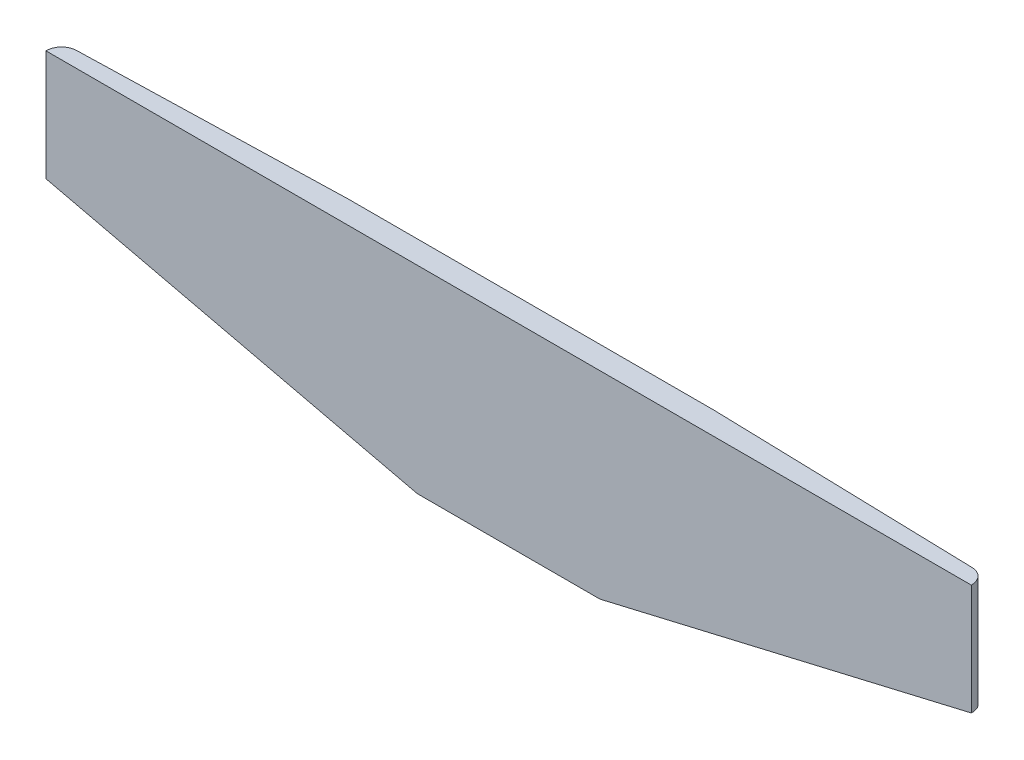
ISO-10303-21;
HEADER;
FILE_DESCRIPTION(('STEP AP214'),'2;1');
FILE_NAME('part.step','',(''),(''),'','','');
FILE_SCHEMA(('AUTOMOTIVE_DESIGN { 1 0 10303 214 1 1 1 1 }'));
ENDSEC;
DATA;
#1=APPLICATION_CONTEXT('core data for automotive mechanical design processes');
#2=APPLICATION_PROTOCOL_DEFINITION('international standard','automotive_design',2000,#1);
#3=PRODUCT_CONTEXT('',#1,'mechanical');
#4=PRODUCT('Part','Part','',(#3));
#5=PRODUCT_RELATED_PRODUCT_CATEGORY('part','',(#4));
#6=PRODUCT_DEFINITION_FORMATION('','',#4);
#7=PRODUCT_DEFINITION_CONTEXT('part definition',#1,'design');
#8=PRODUCT_DEFINITION('design','',#6,#7);
#9=PRODUCT_DEFINITION_SHAPE('','',#8);
#10=(LENGTH_UNIT() NAMED_UNIT(*) SI_UNIT(.MILLI.,.METRE.));
#11=(NAMED_UNIT(*) PLANE_ANGLE_UNIT() SI_UNIT($,.RADIAN.));
#12=(NAMED_UNIT(*) SI_UNIT($,.STERADIAN.) SOLID_ANGLE_UNIT());
#13=UNCERTAINTY_MEASURE_WITH_UNIT(LENGTH_MEASURE(1.E-05),#10,'distance_accuracy_value','');
#14=(GEOMETRIC_REPRESENTATION_CONTEXT(3) GLOBAL_UNCERTAINTY_ASSIGNED_CONTEXT((#13)) GLOBAL_UNIT_ASSIGNED_CONTEXT((#10,
#11,#12)) REPRESENTATION_CONTEXT('',''));
#15=CARTESIAN_POINT('',(0.,0.,0.));
#16=DIRECTION('',(0.,0.,1.));
#17=DIRECTION('',(1.,0.,0.));
#18=AXIS2_PLACEMENT_3D('',#15,#16,#17);
#19=CARTESIAN_POINT('',(6.35,-82.55,-0.170210292050006));
#20=DIRECTION('',(0.,-1.,0.));
#21=DIRECTION('',(0.,0.,-1.));
#22=AXIS2_PLACEMENT_3D('',#19,#20,#21);
#23=CYLINDRICAL_SURFACE('',#22,6.35);
#24=DIRECTION('',(0.,-1.,0.));
#25=VECTOR('',#24,1.);
#26=CARTESIAN_POINT('',(0.,-82.55,-0.170210292050006));
#27=LINE('',#26,#25);
#28=CARTESIAN_POINT('',(0.,0.,-0.170210292050006));
#29=VERTEX_POINT('',#28);
#30=CARTESIAN_POINT('',(0.,-46.228,-0.170210292050006));
#31=VERTEX_POINT('',#30);
#32=EDGE_CURVE('E177',#29,#31,#27,.T.);
#33=ORIENTED_EDGE('',*,*,#32,.F.);
#34=CARTESIAN_POINT('',(6.35,0.,-0.170210292050006));
#35=DIRECTION('',(0.,1.,0.));
#36=DIRECTION('',(0.,0.,1.));
#37=AXIS2_PLACEMENT_3D('',#34,#35,#36);
#38=CIRCLE('',#37,6.35);
#39=CARTESIAN_POINT('',(6.17750932583708,0.,-6.51786710124557));
#40=VERTEX_POINT('',#39);
#41=EDGE_CURVE('E42',#40,#29,#38,.T.);
#42=ORIENTED_EDGE('',*,*,#41,.F.);
#43=DIRECTION('',(0.,-1.,0.));
#44=VECTOR('',#43,1.);
#45=CARTESIAN_POINT('',(6.17750932583708,-82.55,-6.51786710124557));
#46=LINE('',#45,#44);
#47=CARTESIAN_POINT('',(6.17750932583708,-47.6761702190077,-6.51786710124557));
#48=VERTEX_POINT('',#47);
#49=EDGE_CURVE('E180',#48,#40,#46,.F.);
#50=ORIENTED_EDGE('',*,*,#49,.F.);
#51=CARTESIAN_POINT('',(6.35,-47.716606557377,-0.170210292050006));
#52=DIRECTION('',(-0.228238602661553,-0.973605228136693,0.));
#53=DIRECTION('',(0.973605228136693,-0.228238602661553,0.));
#54=AXIS2_PLACEMENT_3D('',#51,#52,#53);
#55=ELLIPSE('',#54,6.52215067923656,6.35);
#56=EDGE_CURVE('E12',#31,#48,#55,.T.);
#57=ORIENTED_EDGE('',*,*,#56,.F.);
#58=EDGE_LOOP('',(#33,#42,#50,#57));
#59=FACE_BOUND('',#58,.T.);
#60=ADVANCED_FACE('F35',(#59),#23,.T.);
#61=CARTESIAN_POINT('',(379.73,-82.55,-0.170210292050002));
#62=DIRECTION('',(0.,1.,0.));
#63=DIRECTION('',(0.,0.,1.));
#64=AXIS2_PLACEMENT_3D('',#61,#62,#63);
#65=CYLINDRICAL_SURFACE('',#64,6.35);
#66=DIRECTION('',(0.,1.,0.));
#67=VECTOR('',#66,1.);
#68=CARTESIAN_POINT('',(386.08,-82.55,-0.170210292050113));
#69=LINE('',#68,#67);
#70=CARTESIAN_POINT('',(386.08,-46.228,-0.170210292050112));
#71=VERTEX_POINT('',#70);
#72=CARTESIAN_POINT('',(386.08,0.,-0.170210292050112));
#73=VERTEX_POINT('',#72);
#74=EDGE_CURVE('E161',#71,#73,#69,.T.);
#75=ORIENTED_EDGE('',*,*,#74,.F.);
#76=CARTESIAN_POINT('',(379.73,-47.7166065573771,-0.170210292050002));
#77=DIRECTION('',(0.228238602661553,-0.973605228136693,0.));
#78=DIRECTION('',(0.973605228136693,0.228238602661553,0.));
#79=AXIS2_PLACEMENT_3D('',#76,#77,#78);
#80=ELLIPSE('',#79,6.52215067923656,6.35);
#81=CARTESIAN_POINT('',(379.902490674163,-47.6761702190077,-6.51786710124557));
#82=VERTEX_POINT('',#81);
#83=EDGE_CURVE('E173',#82,#71,#80,.T.);
#84=ORIENTED_EDGE('',*,*,#83,.F.);
#85=DIRECTION('',(0.,1.,0.));
#86=VECTOR('',#85,1.);
#87=CARTESIAN_POINT('',(379.902490674163,-82.55,-6.51786710124557));
#88=LINE('',#87,#86);
#89=CARTESIAN_POINT('',(379.902490674163,0.,-6.51786710124557));
#90=VERTEX_POINT('',#89);
#91=EDGE_CURVE('E170',#90,#82,#88,.F.);
#92=ORIENTED_EDGE('',*,*,#91,.F.);
#93=CARTESIAN_POINT('',(379.73,0.,-0.170210292050002));
#94=DIRECTION('',(0.,1.,0.));
#95=DIRECTION('',(0.,0.,1.));
#96=AXIS2_PLACEMENT_3D('',#93,#94,#95);
#97=CIRCLE('',#96,6.35);
#98=EDGE_CURVE('E175',#73,#90,#97,.T.);
#99=ORIENTED_EDGE('',*,*,#98,.F.);
#100=EDGE_LOOP('',(#75,#84,#92,#99));
#101=FACE_BOUND('',#100,.T.);
#102=ADVANCED_FACE('F202',(#101),#65,.T.);
#103=CARTESIAN_POINT('',(0.,-82.55,-9.52499999999998));
#104=DIRECTION('',(0.,0.,-1.));
#105=DIRECTION('',(-1.,0.,0.));
#106=AXIS2_PLACEMENT_3D('',#103,#104,#105);
#107=PLANE('',#106);
#108=DIRECTION('',(0.,1.,0.));
#109=VECTOR('',#108,1.);
#110=CARTESIAN_POINT('',(269.24,-82.55,-9.52499999999998));
#111=LINE('',#110,#109);
#112=CARTESIAN_POINT('',(269.239999999994,-73.6183606557392,-9.52500000000007));
#113=VERTEX_POINT('',#112);
#114=CARTESIAN_POINT('',(269.24,0.,-9.52499999999998));
#115=VERTEX_POINT('',#114);
#116=EDGE_CURVE('E130',#113,#115,#111,.T.);
#117=ORIENTED_EDGE('',*,*,#116,.F.);
#118=DIRECTION('',(0.973605228136693,0.228238602661553,0.));
#119=VECTOR('',#118,1.);
#120=CARTESIAN_POINT('',(231.14,-82.55,-9.52499999999998));
#121=LINE('',#120,#119);
#122=CARTESIAN_POINT('',(231.14,-82.55,-9.52499999999998));
#123=VERTEX_POINT('',#122);
#124=EDGE_CURVE('E112',#123,#113,#121,.T.);
#125=ORIENTED_EDGE('',*,*,#124,.F.);
#126=DIRECTION('',(-1.,0.,0.));
#127=VECTOR('',#126,1.);
#128=CARTESIAN_POINT('',(0.,-82.55,-9.52499999999998));
#129=LINE('',#128,#127);
#130=CARTESIAN_POINT('',(154.94,-82.55,-9.52499999999998));
#131=VERTEX_POINT('',#130);
#132=EDGE_CURVE('E127',#123,#131,#129,.T.);
#133=ORIENTED_EDGE('',*,*,#132,.T.);
#134=DIRECTION('',(0.973605228136693,-0.228238602661553,0.));
#135=VECTOR('',#134,1.);
#136=CARTESIAN_POINT('',(154.94,-82.55,-9.52499999999998));
#137=LINE('',#136,#135);
#138=CARTESIAN_POINT('',(116.840000000045,-73.6183606557482,-9.52500000000059));
#139=VERTEX_POINT('',#138);
#140=EDGE_CURVE('E132',#139,#131,#137,.T.);
#141=ORIENTED_EDGE('',*,*,#140,.F.);
#142=DIRECTION('',(0.,1.,0.));
#143=VECTOR('',#142,1.);
#144=CARTESIAN_POINT('',(116.84,-82.55,-9.52499999999998));
#145=LINE('',#144,#143);
#146=CARTESIAN_POINT('',(116.84,0.,-9.52499999999998));
#147=VERTEX_POINT('',#146);
#148=EDGE_CURVE('E139',#139,#147,#145,.T.);
#149=ORIENTED_EDGE('',*,*,#148,.T.);
#150=DIRECTION('',(-1.,0.,0.));
#151=VECTOR('',#150,1.);
#152=CARTESIAN_POINT('',(0.,0.,-9.52499999999998));
#153=LINE('',#152,#151);
#154=EDGE_CURVE('E147',#115,#147,#153,.T.);
#155=ORIENTED_EDGE('',*,*,#154,.F.);
#156=EDGE_LOOP('',(#117,#125,#133,#141,#149,#155));
#157=FACE_BOUND('',#156,.T.);
#158=ADVANCED_FACE('F125',(#157),#107,.T.);
#159=CARTESIAN_POINT('',(0.457306454945246,-82.55,-16.8288775419851));
#160=DIRECTION('',(0.0271638856949484,0.,-0.999630993574105));
#161=DIRECTION('',(-0.999630993574105,0.,-0.0271638856949484));
#162=AXIS2_PLACEMENT_3D('',#159,#160,#161);
#163=PLANE('',#162);
#164=DIRECTION('',(-0.999630993574105,0.,-0.0271638856949484));
#165=VECTOR('',#164,1.);
#166=CARTESIAN_POINT('',(0.457306454945246,0.,-16.8288775419851));
#167=LINE('',#166,#165);
#168=EDGE_CURVE('E137',#90,#115,#167,.T.);
#169=ORIENTED_EDGE('',*,*,#168,.F.);
#170=ORIENTED_EDGE('',*,*,#91,.T.);
#171=DIRECTION('',(-0.973264666956542,-0.228158766188173,-0.0264474094281668));
#172=VECTOR('',#171,1.);
#173=CARTESIAN_POINT('',(12.4658222339822,-133.812962984493,-16.5025591784243));
#174=LINE('',#173,#172);
#175=EDGE_CURVE('E144',#82,#113,#174,.T.);
#176=ORIENTED_EDGE('',*,*,#175,.T.);
#177=ORIENTED_EDGE('',*,*,#116,.T.);
#178=EDGE_LOOP('',(#169,#170,#176,#177));
#179=FACE_BOUND('',#178,.T.);
#180=ADVANCED_FACE('F205',(#179),#163,.T.);
#181=CARTESIAN_POINT('',(386.08,-82.55,-6.75015598972095E-12));
#182=DIRECTION('',(1.,0.,0.));
#183=DIRECTION('',(0.,0.,-1.));
#184=AXIS2_PLACEMENT_3D('',#181,#182,#183);
#185=PLANE('',#184);
#186=DIRECTION('',(0.,0.,1.));
#187=VECTOR('',#186,1.);
#188=CARTESIAN_POINT('',(386.08,-46.228,-9.52499999999998));
#189=LINE('',#188,#187);
#190=CARTESIAN_POINT('',(386.08,-46.228,0.));
#191=VERTEX_POINT('',#190);
#192=EDGE_CURVE('E120',#71,#191,#189,.T.);
#193=ORIENTED_EDGE('',*,*,#192,.F.);
#194=ORIENTED_EDGE('',*,*,#74,.T.);
#195=DIRECTION('',(0.,0.,-1.));
#196=VECTOR('',#195,1.);
#197=CARTESIAN_POINT('',(386.08,0.,-6.75015598972095E-12));
#198=LINE('',#197,#196);
#199=CARTESIAN_POINT('',(386.08,0.,0.));
#200=VERTEX_POINT('',#199);
#201=EDGE_CURVE('E141',#200,#73,#198,.T.);
#202=ORIENTED_EDGE('',*,*,#201,.F.);
#203=DIRECTION('',(0.,1.,0.));
#204=VECTOR('',#203,1.);
#205=CARTESIAN_POINT('',(386.08,-82.55,0.));
#206=LINE('',#205,#204);
#207=EDGE_CURVE('E162',#191,#200,#206,.T.);
#208=ORIENTED_EDGE('',*,*,#207,.F.);
#209=EDGE_LOOP('',(#193,#194,#202,#208));
#210=FACE_BOUND('',#209,.T.);
#211=ADVANCED_FACE('F199',(#210),#185,.T.);
#212=CARTESIAN_POINT('',(0.,-82.55,0.));
#213=DIRECTION('',(0.,0.,1.));
#214=DIRECTION('',(1.,0.,0.));
#215=AXIS2_PLACEMENT_3D('',#212,#213,#214);
#216=PLANE('',#215);
#217=DIRECTION('',(1.,0.,0.));
#218=VECTOR('',#217,1.);
#219=CARTESIAN_POINT('',(0.,-82.55,0.));
#220=LINE('',#219,#218);
#221=CARTESIAN_POINT('',(154.94,-82.55,0.));
#222=VERTEX_POINT('',#221);
#223=CARTESIAN_POINT('',(231.14,-82.55,0.));
#224=VERTEX_POINT('',#223);
#225=EDGE_CURVE('E136',#222,#224,#220,.T.);
#226=ORIENTED_EDGE('',*,*,#225,.T.);
#227=DIRECTION('',(0.973605228136693,0.228238602661553,0.));
#228=VECTOR('',#227,1.);
#229=CARTESIAN_POINT('',(231.14,-82.55,0.));
#230=LINE('',#229,#228);
#231=EDGE_CURVE('E115',#224,#191,#230,.T.);
#232=ORIENTED_EDGE('',*,*,#231,.T.);
#233=ORIENTED_EDGE('',*,*,#207,.T.);
#234=DIRECTION('',(1.,0.,0.));
#235=VECTOR('',#234,1.);
#236=CARTESIAN_POINT('',(0.,0.,0.));
#237=LINE('',#236,#235);
#238=CARTESIAN_POINT('',(0.,0.,0.));
#239=VERTEX_POINT('',#238);
#240=EDGE_CURVE('E155',#239,#200,#237,.T.);
#241=ORIENTED_EDGE('',*,*,#240,.F.);
#242=DIRECTION('',(0.,1.,0.));
#243=VECTOR('',#242,1.);
#244=CARTESIAN_POINT('',(0.,-82.55,0.));
#245=LINE('',#244,#243);
#246=CARTESIAN_POINT('',(0.,-46.228,0.));
#247=VERTEX_POINT('',#246);
#248=EDGE_CURVE('E164',#247,#239,#245,.T.);
#249=ORIENTED_EDGE('',*,*,#248,.F.);
#250=DIRECTION('',(0.973605228136693,-0.228238602661553,0.));
#251=VECTOR('',#250,1.);
#252=CARTESIAN_POINT('',(154.94,-82.55,0.));
#253=LINE('',#252,#251);
#254=EDGE_CURVE('E193',#247,#222,#253,.T.);
#255=ORIENTED_EDGE('',*,*,#254,.T.);
#256=EDGE_LOOP('',(#226,#232,#233,#241,#249,#255));
#257=FACE_BOUND('',#256,.T.);
#258=ADVANCED_FACE('F192',(#257),#216,.T.);
#259=CARTESIAN_POINT('',(0.,-82.55,0.));
#260=DIRECTION('',(1.,0.,0.));
#261=DIRECTION('',(0.,0.,-1.));
#262=AXIS2_PLACEMENT_3D('',#259,#260,#261);
#263=PLANE('',#262);
#264=DIRECTION('',(0.,0.,-1.));
#265=VECTOR('',#264,1.);
#266=CARTESIAN_POINT('',(0.,0.,0.));
#267=LINE('',#266,#265);
#268=EDGE_CURVE('E152',#239,#29,#267,.T.);
#269=ORIENTED_EDGE('',*,*,#268,.T.);
#270=ORIENTED_EDGE('',*,*,#32,.T.);
#271=DIRECTION('',(0.,0.,1.));
#272=VECTOR('',#271,1.);
#273=CARTESIAN_POINT('',(0.,-46.228,-9.52499999999998));
#274=LINE('',#273,#272);
#275=EDGE_CURVE('E131',#31,#247,#274,.T.);
#276=ORIENTED_EDGE('',*,*,#275,.T.);
#277=ORIENTED_EDGE('',*,*,#248,.T.);
#278=EDGE_LOOP('',(#269,#270,#276,#277));
#279=FACE_BOUND('',#278,.T.);
#280=ADVANCED_FACE('F187',(#279),#263,.F.);
#281=CARTESIAN_POINT('',(-0.172427023995749,-82.55,-6.34531448304359));
#282=DIRECTION('',(0.0271638856949484,0.,0.999630993574105));
#283=DIRECTION('',(0.999630993574105,0.,-0.0271638856949484));
#284=AXIS2_PLACEMENT_3D('',#281,#282,#283);
#285=PLANE('',#284);
#286=DIRECTION('',(0.973264666956543,-0.228158766188173,-0.0264474094281668));
#287=VECTOR('',#286,1.);
#288=CARTESIAN_POINT('',(7.9021710258947,-48.0804761585294,-6.56473290831235));
#289=LINE('',#288,#287);
#290=EDGE_CURVE('E210',#48,#139,#289,.T.);
#291=ORIENTED_EDGE('',*,*,#290,.F.);
#292=ORIENTED_EDGE('',*,*,#49,.T.);
#293=DIRECTION('',(0.999630993574105,0.,-0.0271638856949484));
#294=VECTOR('',#293,1.);
#295=CARTESIAN_POINT('',(-0.172427023995749,0.,-6.34531448304359));
#296=LINE('',#295,#294);
#297=EDGE_CURVE('E150',#40,#147,#296,.T.);
#298=ORIENTED_EDGE('',*,*,#297,.T.);
#299=ORIENTED_EDGE('',*,*,#148,.F.);
#300=EDGE_LOOP('',(#291,#292,#298,#299));
#301=FACE_BOUND('',#300,.T.);
#302=ADVANCED_FACE('F209',(#301),#285,.F.);
#303=CARTESIAN_POINT('',(0.,-82.55,0.));
#304=DIRECTION('',(0.,1.,0.));
#305=DIRECTION('',(0.,0.,1.));
#306=AXIS2_PLACEMENT_3D('',#303,#304,#305);
#307=PLANE('',#306);
#308=DIRECTION('',(0.,0.,1.));
#309=VECTOR('',#308,1.);
#310=CARTESIAN_POINT('',(231.14,-82.55,-9.52499999999998));
#311=LINE('',#310,#309);
#312=EDGE_CURVE('E108',#123,#224,#311,.T.);
#313=ORIENTED_EDGE('',*,*,#312,.T.);
#314=ORIENTED_EDGE('',*,*,#225,.F.);
#315=DIRECTION('',(0.,0.,1.));
#316=VECTOR('',#315,1.);
#317=CARTESIAN_POINT('',(154.94,-82.55,-9.52499999999998));
#318=LINE('',#317,#316);
#319=EDGE_CURVE('E121',#131,#222,#318,.T.);
#320=ORIENTED_EDGE('',*,*,#319,.F.);
#321=ORIENTED_EDGE('',*,*,#132,.F.);
#322=EDGE_LOOP('',(#313,#314,#320,#321));
#323=FACE_BOUND('',#322,.T.);
#324=ADVANCED_FACE('F135',(#323),#307,.F.);
#325=CARTESIAN_POINT('',(0.,0.,0.));
#326=DIRECTION('',(0.,1.,0.));
#327=DIRECTION('',(0.,0.,1.));
#328=AXIS2_PLACEMENT_3D('',#325,#326,#327);
#329=PLANE('',#328);
#330=ORIENTED_EDGE('',*,*,#297,.F.);
#331=ORIENTED_EDGE('',*,*,#41,.T.);
#332=ORIENTED_EDGE('',*,*,#268,.F.);
#333=ORIENTED_EDGE('',*,*,#240,.T.);
#334=ORIENTED_EDGE('',*,*,#201,.T.);
#335=ORIENTED_EDGE('',*,*,#98,.T.);
#336=ORIENTED_EDGE('',*,*,#168,.T.);
#337=ORIENTED_EDGE('',*,*,#154,.T.);
#338=EDGE_LOOP('',(#330,#331,#332,#333,#334,#335,#336,#337));
#339=FACE_BOUND('',#338,.T.);
#340=ADVANCED_FACE('F184',(#339),#329,.T.);
#341=CARTESIAN_POINT('',(154.94,-82.55,-9.52499999999998));
#342=DIRECTION('',(-0.228238602661553,-0.973605228136693,0.));
#343=DIRECTION('',(0.973605228136693,-0.228238602661553,0.));
#344=AXIS2_PLACEMENT_3D('',#341,#342,#343);
#345=PLANE('',#344);
#346=ORIENTED_EDGE('',*,*,#275,.F.);
#347=ORIENTED_EDGE('',*,*,#56,.T.);
#348=ORIENTED_EDGE('',*,*,#290,.T.);
#349=ORIENTED_EDGE('',*,*,#140,.T.);
#350=ORIENTED_EDGE('',*,*,#319,.T.);
#351=ORIENTED_EDGE('',*,*,#254,.F.);
#352=EDGE_LOOP('',(#346,#347,#348,#349,#350,#351));
#353=FACE_BOUND('',#352,.T.);
#354=ADVANCED_FACE('F217',(#353),#345,.T.);
#355=CARTESIAN_POINT('',(231.14,-82.55,-9.52499999999998));
#356=DIRECTION('',(0.228238602661553,-0.973605228136693,0.));
#357=DIRECTION('',(0.973605228136693,0.228238602661553,0.));
#358=AXIS2_PLACEMENT_3D('',#355,#356,#357);
#359=PLANE('',#358);
#360=ORIENTED_EDGE('',*,*,#175,.F.);
#361=ORIENTED_EDGE('',*,*,#83,.T.);
#362=ORIENTED_EDGE('',*,*,#192,.T.);
#363=ORIENTED_EDGE('',*,*,#231,.F.);
#364=ORIENTED_EDGE('',*,*,#312,.F.);
#365=ORIENTED_EDGE('',*,*,#124,.T.);
#366=EDGE_LOOP('',(#360,#361,#362,#363,#364,#365));
#367=FACE_BOUND('',#366,.T.);
#368=ADVANCED_FACE('F111',(#367),#359,.T.);
#369=CLOSED_SHELL('',(#60,#102,#158,#180,#211,#258,#280,#302,#324,#340,#354,#368));
#370=MANIFOLD_SOLID_BREP('B2',#369);
#371=ADVANCED_BREP_SHAPE_REPRESENTATION('',(#18,#370),#14);
#372=SHAPE_DEFINITION_REPRESENTATION(#9,#371);
ENDSEC;
END-ISO-10303-21;
